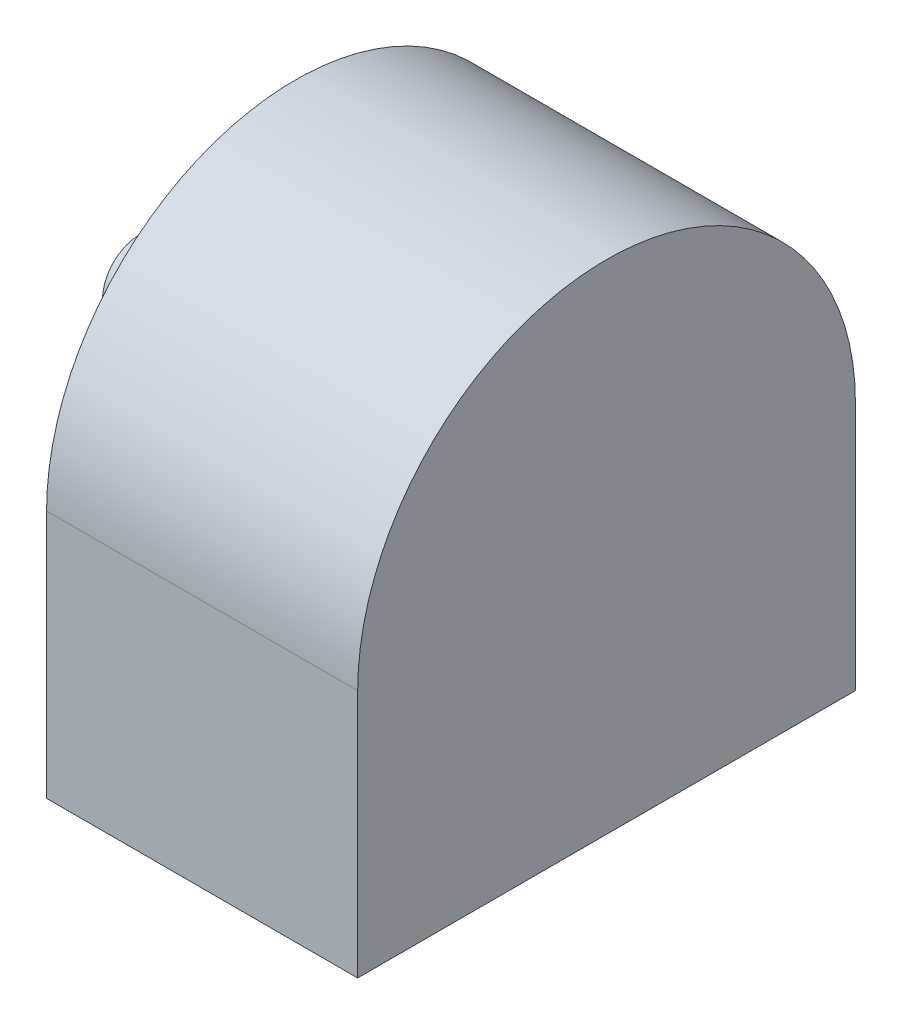
ISO-10303-21;
HEADER;
FILE_DESCRIPTION(('STEP AP214'),'2;1');
FILE_NAME('part.step','',(''),(''),'','','');
FILE_SCHEMA(('AUTOMOTIVE_DESIGN { 1 0 10303 214 1 1 1 1 }'));
ENDSEC;
DATA;
#1=APPLICATION_CONTEXT('core data for automotive mechanical design processes');
#2=APPLICATION_PROTOCOL_DEFINITION('international standard','automotive_design',2000,#1);
#3=PRODUCT_CONTEXT('',#1,'mechanical');
#4=PRODUCT('Part','Part','',(#3));
#5=PRODUCT_RELATED_PRODUCT_CATEGORY('part','',(#4));
#6=PRODUCT_DEFINITION_FORMATION('','',#4);
#7=PRODUCT_DEFINITION_CONTEXT('part definition',#1,'design');
#8=PRODUCT_DEFINITION('design','',#6,#7);
#9=PRODUCT_DEFINITION_SHAPE('','',#8);
#10=(LENGTH_UNIT() NAMED_UNIT(*) SI_UNIT(.MILLI.,.METRE.));
#11=(NAMED_UNIT(*) PLANE_ANGLE_UNIT() SI_UNIT($,.RADIAN.));
#12=(NAMED_UNIT(*) SI_UNIT($,.STERADIAN.) SOLID_ANGLE_UNIT());
#13=UNCERTAINTY_MEASURE_WITH_UNIT(LENGTH_MEASURE(1.E-05),#10,'distance_accuracy_value','');
#14=(GEOMETRIC_REPRESENTATION_CONTEXT(3) GLOBAL_UNCERTAINTY_ASSIGNED_CONTEXT((#13)) GLOBAL_UNIT_ASSIGNED_CONTEXT((#10,
#11,#12)) REPRESENTATION_CONTEXT('',''));
#15=CARTESIAN_POINT('',(0.,0.,0.));
#16=DIRECTION('',(0.,0.,1.));
#17=DIRECTION('',(1.,0.,0.));
#18=AXIS2_PLACEMENT_3D('',#15,#16,#17);
#19=CARTESIAN_POINT('',(0.,80.,0.));
#20=DIRECTION('',(1.,0.,0.));
#21=DIRECTION('',(0.,1.,0.));
#22=AXIS2_PLACEMENT_3D('',#19,#20,#21);
#23=PLANE('',#22);
#24=CARTESIAN_POINT('',(0.,0.,0.));
#25=DIRECTION('',(1.,0.,0.));
#26=DIRECTION('',(0.,1.,0.));
#27=AXIS2_PLACEMENT_3D('',#24,#25,#26);
#28=CIRCLE('',#27,80.);
#29=CARTESIAN_POINT('',(0.,0.,-80.));
#30=VERTEX_POINT('',#29);
#31=CARTESIAN_POINT('',(0.,0.,80.));
#32=VERTEX_POINT('',#31);
#33=EDGE_CURVE('E54',#30,#32,#28,.T.);
#34=ORIENTED_EDGE('',*,*,#33,.T.);
#35=DIRECTION('',(0.,-1.,0.));
#36=VECTOR('',#35,1.);
#37=CARTESIAN_POINT('',(0.,0.,80.));
#38=LINE('',#37,#36);
#39=CARTESIAN_POINT('',(0.,-80.,80.));
#40=VERTEX_POINT('',#39);
#41=EDGE_CURVE('E130',#32,#40,#38,.T.);
#42=ORIENTED_EDGE('',*,*,#41,.T.);
#43=DIRECTION('',(0.,0.,-1.));
#44=VECTOR('',#43,1.);
#45=CARTESIAN_POINT('',(0.,-80.,80.));
#46=LINE('',#45,#44);
#47=CARTESIAN_POINT('',(0.,-80.,-80.));
#48=VERTEX_POINT('',#47);
#49=EDGE_CURVE('E133',#40,#48,#46,.T.);
#50=ORIENTED_EDGE('',*,*,#49,.T.);
#51=DIRECTION('',(0.,1.,0.));
#52=VECTOR('',#51,1.);
#53=CARTESIAN_POINT('',(0.,0.,-80.));
#54=LINE('',#53,#52);
#55=EDGE_CURVE('E89',#48,#30,#54,.T.);
#56=ORIENTED_EDGE('',*,*,#55,.T.);
#57=EDGE_LOOP('',(#34,#42,#50,#56));
#58=FACE_BOUND('',#57,.T.);
#59=ADVANCED_FACE('F40',(#58),#23,.T.);
#60=CARTESIAN_POINT('',(-150.,0.,0.));
#61=DIRECTION('',(-1.,0.,0.));
#62=DIRECTION('',(0.,-1.,0.));
#63=AXIS2_PLACEMENT_3D('',#60,#61,#62);
#64=PLANE('',#63);
#65=CARTESIAN_POINT('',(-150.,0.,0.));
#66=DIRECTION('',(1.,0.,0.));
#67=DIRECTION('',(0.,1.,0.));
#68=AXIS2_PLACEMENT_3D('',#65,#66,#67);
#69=CIRCLE('',#68,12.);
#70=CARTESIAN_POINT('',(-150.,12.,0.));
#71=VERTEX_POINT('',#70);
#72=EDGE_CURVE('E11',#71,#71,#69,.T.);
#73=ORIENTED_EDGE('',*,*,#72,.F.);
#74=EDGE_LOOP('',(#73));
#75=FACE_BOUND('',#74,.T.);
#76=ADVANCED_FACE('F114',(#75),#64,.T.);
#77=CARTESIAN_POINT('',(0.,0.,0.));
#78=DIRECTION('',(1.,0.,0.));
#79=DIRECTION('',(0.,1.,0.));
#80=AXIS2_PLACEMENT_3D('',#77,#78,#79);
#81=CYLINDRICAL_SURFACE('',#80,12.);
#82=ORIENTED_EDGE('',*,*,#72,.T.);
#83=EDGE_LOOP('',(#82));
#84=FACE_BOUND('',#83,.T.);
#85=CARTESIAN_POINT('',(-100.,0.,0.));
#86=DIRECTION('',(1.,0.,0.));
#87=DIRECTION('',(0.,1.,0.));
#88=AXIS2_PLACEMENT_3D('',#85,#86,#87);
#89=CIRCLE('',#88,12.);
#90=CARTESIAN_POINT('',(-100.,12.,0.));
#91=VERTEX_POINT('',#90);
#92=EDGE_CURVE('E47',#91,#91,#89,.T.);
#93=ORIENTED_EDGE('',*,*,#92,.F.);
#94=EDGE_LOOP('',(#93));
#95=FACE_BOUND('',#94,.T.);
#96=ADVANCED_FACE('F112',(#84,#95),#81,.T.);
#97=CARTESIAN_POINT('',(-100.,12.,0.));
#98=DIRECTION('',(-1.,0.,0.));
#99=DIRECTION('',(0.,-1.,0.));
#100=AXIS2_PLACEMENT_3D('',#97,#98,#99);
#101=PLANE('',#100);
#102=ORIENTED_EDGE('',*,*,#92,.T.);
#103=EDGE_LOOP('',(#102));
#104=FACE_BOUND('',#103,.T.);
#105=DIRECTION('',(0.,-1.,0.));
#106=VECTOR('',#105,1.);
#107=CARTESIAN_POINT('',(-100.,0.,80.));
#108=LINE('',#107,#106);
#109=CARTESIAN_POINT('',(-100.,0.,80.));
#110=VERTEX_POINT('',#109);
#111=CARTESIAN_POINT('',(-100.,-80.,80.));
#112=VERTEX_POINT('',#111);
#113=EDGE_CURVE('E106',#110,#112,#108,.T.);
#114=ORIENTED_EDGE('',*,*,#113,.F.);
#115=CARTESIAN_POINT('',(-100.,0.,0.));
#116=DIRECTION('',(1.,0.,0.));
#117=DIRECTION('',(0.,1.,0.));
#118=AXIS2_PLACEMENT_3D('',#115,#116,#117);
#119=CIRCLE('',#118,80.);
#120=CARTESIAN_POINT('',(-100.,0.,-80.));
#121=VERTEX_POINT('',#120);
#122=EDGE_CURVE('E95',#121,#110,#119,.T.);
#123=ORIENTED_EDGE('',*,*,#122,.F.);
#124=DIRECTION('',(0.,1.,0.));
#125=VECTOR('',#124,1.);
#126=CARTESIAN_POINT('',(-100.,0.,-80.));
#127=LINE('',#126,#125);
#128=CARTESIAN_POINT('',(-100.,-80.,-80.));
#129=VERTEX_POINT('',#128);
#130=EDGE_CURVE('E93',#129,#121,#127,.T.);
#131=ORIENTED_EDGE('',*,*,#130,.F.);
#132=DIRECTION('',(0.,0.,-1.));
#133=VECTOR('',#132,1.);
#134=CARTESIAN_POINT('',(-100.,-80.,80.));
#135=LINE('',#134,#133);
#136=EDGE_CURVE('E78',#112,#129,#135,.T.);
#137=ORIENTED_EDGE('',*,*,#136,.F.);
#138=EDGE_LOOP('',(#114,#123,#131,#137));
#139=FACE_BOUND('',#138,.T.);
#140=ADVANCED_FACE('F94',(#104,#139),#101,.T.);
#141=CARTESIAN_POINT('',(0.,0.,0.));
#142=DIRECTION('',(1.,0.,0.));
#143=DIRECTION('',(0.,1.,0.));
#144=AXIS2_PLACEMENT_3D('',#141,#142,#143);
#145=CYLINDRICAL_SURFACE('',#144,80.);
#146=DIRECTION('',(1.,0.,0.));
#147=VECTOR('',#146,1.);
#148=CARTESIAN_POINT('',(-278.885438199983,0.,-80.));
#149=LINE('',#148,#147);
#150=EDGE_CURVE('E97',#121,#30,#149,.T.);
#151=ORIENTED_EDGE('',*,*,#150,.F.);
#152=ORIENTED_EDGE('',*,*,#122,.T.);
#153=DIRECTION('',(1.,0.,0.));
#154=VECTOR('',#153,1.);
#155=CARTESIAN_POINT('',(-278.885438199983,0.,80.));
#156=LINE('',#155,#154);
#157=EDGE_CURVE('E59',#110,#32,#156,.T.);
#158=ORIENTED_EDGE('',*,*,#157,.T.);
#159=ORIENTED_EDGE('',*,*,#33,.F.);
#160=EDGE_LOOP('',(#151,#152,#158,#159));
#161=FACE_BOUND('',#160,.T.);
#162=ADVANCED_FACE('F121',(#161),#145,.T.);
#163=CARTESIAN_POINT('',(-278.885438199983,-80.,80.));
#164=DIRECTION('',(0.,-1.,0.));
#165=DIRECTION('',(1.,0.,0.));
#166=AXIS2_PLACEMENT_3D('',#163,#164,#165);
#167=PLANE('',#166);
#168=CARTESIAN_POINT('',(-50.,-80.,54.6947601981217));
#169=DIRECTION('',(0.,-1.,0.));
#170=DIRECTION('',(1.,0.,0.));
#171=AXIS2_PLACEMENT_3D('',#168,#169,#170);
#172=CIRCLE('',#171,12.5);
#173=CARTESIAN_POINT('',(-37.5,-80.,54.6947601981217));
#174=VERTEX_POINT('',#173);
#175=EDGE_CURVE('E138',#174,#174,#172,.T.);
#176=ORIENTED_EDGE('',*,*,#175,.F.);
#177=EDGE_LOOP('',(#176));
#178=FACE_BOUND('',#177,.T.);
#179=CARTESIAN_POINT('',(-50.,-80.,-65.3052398018783));
#180=DIRECTION('',(0.,-1.,0.));
#181=DIRECTION('',(1.,0.,0.));
#182=AXIS2_PLACEMENT_3D('',#179,#180,#181);
#183=CIRCLE('',#182,12.5);
#184=CARTESIAN_POINT('',(-37.5,-80.,-65.3052398018783));
#185=VERTEX_POINT('',#184);
#186=EDGE_CURVE('E178',#185,#185,#183,.T.);
#187=ORIENTED_EDGE('',*,*,#186,.F.);
#188=EDGE_LOOP('',(#187));
#189=FACE_BOUND('',#188,.T.);
#190=ORIENTED_EDGE('',*,*,#136,.T.);
#191=DIRECTION('',(1.,0.,0.));
#192=VECTOR('',#191,1.);
#193=CARTESIAN_POINT('',(-278.885438199983,-80.,-80.));
#194=LINE('',#193,#192);
#195=EDGE_CURVE('E82',#129,#48,#194,.T.);
#196=ORIENTED_EDGE('',*,*,#195,.T.);
#197=ORIENTED_EDGE('',*,*,#49,.F.);
#198=DIRECTION('',(1.,0.,0.));
#199=VECTOR('',#198,1.);
#200=CARTESIAN_POINT('',(-278.885438199983,-80.,80.));
#201=LINE('',#200,#199);
#202=EDGE_CURVE('E85',#112,#40,#201,.T.);
#203=ORIENTED_EDGE('',*,*,#202,.F.);
#204=EDGE_LOOP('',(#190,#196,#197,#203));
#205=FACE_BOUND('',#204,.T.);
#206=ADVANCED_FACE('F80',(#178,#189,#205),#167,.T.);
#207=CARTESIAN_POINT('',(-278.885438199983,0.,-80.));
#208=DIRECTION('',(0.,0.,-1.));
#209=DIRECTION('',(-1.,0.,0.));
#210=AXIS2_PLACEMENT_3D('',#207,#208,#209);
#211=PLANE('',#210);
#212=ORIENTED_EDGE('',*,*,#195,.F.);
#213=ORIENTED_EDGE('',*,*,#130,.T.);
#214=ORIENTED_EDGE('',*,*,#150,.T.);
#215=ORIENTED_EDGE('',*,*,#55,.F.);
#216=EDGE_LOOP('',(#212,#213,#214,#215));
#217=FACE_BOUND('',#216,.T.);
#218=ADVANCED_FACE('F99',(#217),#211,.T.);
#219=CARTESIAN_POINT('',(-278.885438199983,0.,80.));
#220=DIRECTION('',(0.,0.,1.));
#221=DIRECTION('',(1.,0.,0.));
#222=AXIS2_PLACEMENT_3D('',#219,#220,#221);
#223=PLANE('',#222);
#224=ORIENTED_EDGE('',*,*,#157,.F.);
#225=ORIENTED_EDGE('',*,*,#113,.T.);
#226=ORIENTED_EDGE('',*,*,#202,.T.);
#227=ORIENTED_EDGE('',*,*,#41,.F.);
#228=EDGE_LOOP('',(#224,#225,#226,#227));
#229=FACE_BOUND('',#228,.T.);
#230=ADVANCED_FACE('F132',(#229),#223,.T.);
#231=CARTESIAN_POINT('',(-50.,-30.,-65.3052398018783));
#232=DIRECTION('',(0.,-1.,0.));
#233=DIRECTION('',(1.,0.,0.));
#234=AXIS2_PLACEMENT_3D('',#231,#232,#233);
#235=CYLINDRICAL_SURFACE('',#234,12.5);
#236=CARTESIAN_POINT('',(-50.,-30.,-65.3052398018783));
#237=DIRECTION('',(0.,-1.,0.));
#238=DIRECTION('',(1.,0.,0.));
#239=AXIS2_PLACEMENT_3D('',#236,#237,#238);
#240=CIRCLE('',#239,12.5);
#241=CARTESIAN_POINT('',(-37.5,-30.,-65.3052398018783));
#242=VERTEX_POINT('',#241);
#243=EDGE_CURVE('E175',#242,#242,#240,.T.);
#244=ORIENTED_EDGE('',*,*,#243,.F.);
#245=EDGE_LOOP('',(#244));
#246=FACE_BOUND('',#245,.T.);
#247=ORIENTED_EDGE('',*,*,#186,.T.);
#248=EDGE_LOOP('',(#247));
#249=FACE_BOUND('',#248,.T.);
#250=ADVANCED_FACE('F154',(#246,#249),#235,.F.);
#251=CARTESIAN_POINT('',(-50.,-30.,-65.3052398018783));
#252=DIRECTION('',(0.,-1.,0.));
#253=DIRECTION('',(1.,0.,0.));
#254=AXIS2_PLACEMENT_3D('',#251,#252,#253);
#255=PLANE('',#254);
#256=ORIENTED_EDGE('',*,*,#243,.T.);
#257=EDGE_LOOP('',(#256));
#258=FACE_BOUND('',#257,.T.);
#259=ADVANCED_FACE('F157',(#258),#255,.T.);
#260=CARTESIAN_POINT('',(-50.,-30.,54.6947601981217));
#261=DIRECTION('',(0.,-1.,0.));
#262=DIRECTION('',(1.,0.,0.));
#263=AXIS2_PLACEMENT_3D('',#260,#261,#262);
#264=CYLINDRICAL_SURFACE('',#263,12.5);
#265=CARTESIAN_POINT('',(-50.,-30.,54.6947601981217));
#266=DIRECTION('',(0.,-1.,0.));
#267=DIRECTION('',(1.,0.,0.));
#268=AXIS2_PLACEMENT_3D('',#265,#266,#267);
#269=CIRCLE('',#268,12.5);
#270=CARTESIAN_POINT('',(-37.5,-30.,54.6947601981217));
#271=VERTEX_POINT('',#270);
#272=EDGE_CURVE('E134',#271,#271,#269,.T.);
#273=ORIENTED_EDGE('',*,*,#272,.F.);
#274=EDGE_LOOP('',(#273));
#275=FACE_BOUND('',#274,.T.);
#276=ORIENTED_EDGE('',*,*,#175,.T.);
#277=EDGE_LOOP('',(#276));
#278=FACE_BOUND('',#277,.T.);
#279=ADVANCED_FACE('F161',(#275,#278),#264,.F.);
#280=CARTESIAN_POINT('',(-50.,-30.,54.6947601981217));
#281=DIRECTION('',(0.,-1.,0.));
#282=DIRECTION('',(1.,0.,0.));
#283=AXIS2_PLACEMENT_3D('',#280,#281,#282);
#284=PLANE('',#283);
#285=ORIENTED_EDGE('',*,*,#272,.T.);
#286=EDGE_LOOP('',(#285));
#287=FACE_BOUND('',#286,.T.);
#288=ADVANCED_FACE('F165',(#287),#284,.T.);
#289=CLOSED_SHELL('',(#59,#76,#96,#140,#162,#206,#218,#230,#250,#259,#279,#288));
#290=MANIFOLD_SOLID_BREP('B2',#289);
#291=ADVANCED_BREP_SHAPE_REPRESENTATION('',(#18,#290),#14);
#292=SHAPE_DEFINITION_REPRESENTATION(#9,#291);
ENDSEC;
END-ISO-10303-21;
